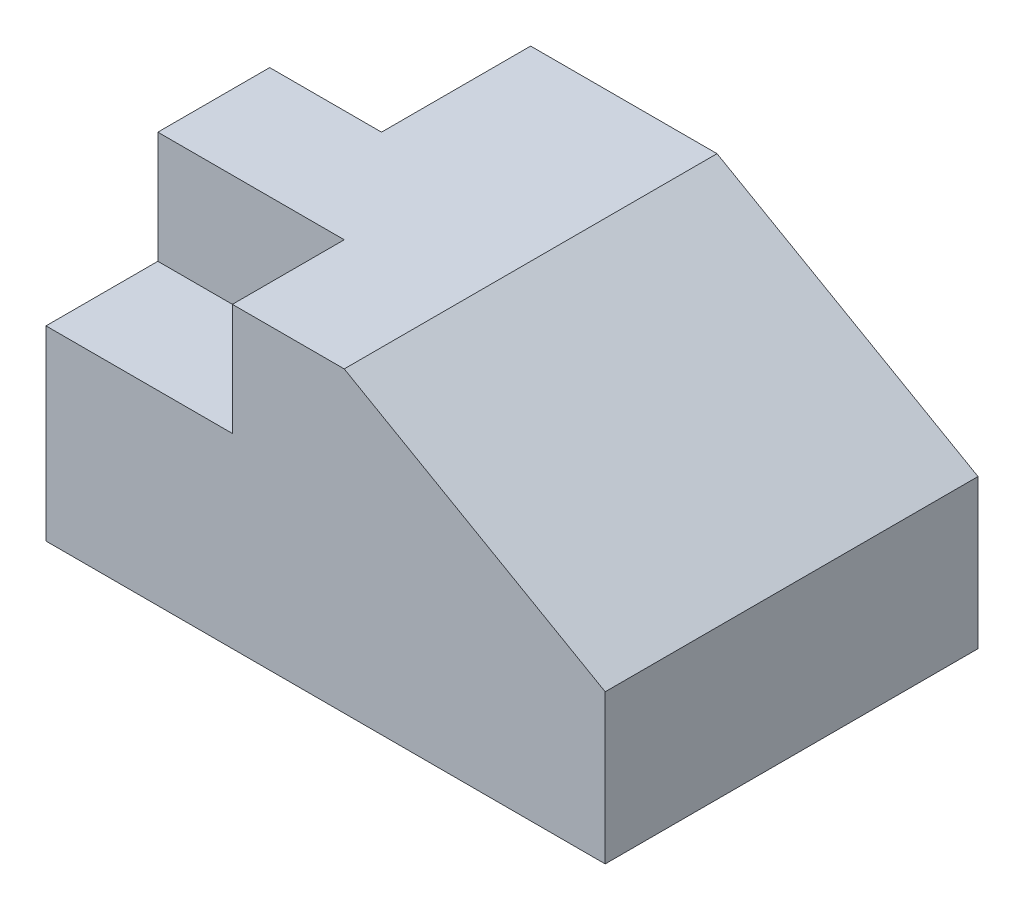
ISO-10303-21;
HEADER;
FILE_DESCRIPTION(('STEP AP214'),'2;1');
FILE_NAME('part.step','',(''),(''),'','','');
FILE_SCHEMA(('AUTOMOTIVE_DESIGN { 1 0 10303 214 1 1 1 1 }'));
ENDSEC;
DATA;
#1=APPLICATION_CONTEXT('core data for automotive mechanical design processes');
#2=APPLICATION_PROTOCOL_DEFINITION('international standard','automotive_design',2000,#1);
#3=PRODUCT_CONTEXT('',#1,'mechanical');
#4=PRODUCT('Part','Part','',(#3));
#5=PRODUCT_RELATED_PRODUCT_CATEGORY('part','',(#4));
#6=PRODUCT_DEFINITION_FORMATION('','',#4);
#7=PRODUCT_DEFINITION_CONTEXT('part definition',#1,'design');
#8=PRODUCT_DEFINITION('design','',#6,#7);
#9=PRODUCT_DEFINITION_SHAPE('','',#8);
#10=(LENGTH_UNIT() NAMED_UNIT(*) SI_UNIT(.MILLI.,.METRE.));
#11=(NAMED_UNIT(*) PLANE_ANGLE_UNIT() SI_UNIT($,.RADIAN.));
#12=(NAMED_UNIT(*) SI_UNIT($,.STERADIAN.) SOLID_ANGLE_UNIT());
#13=UNCERTAINTY_MEASURE_WITH_UNIT(LENGTH_MEASURE(1.E-05),#10,'distance_accuracy_value','');
#14=(GEOMETRIC_REPRESENTATION_CONTEXT(3) GLOBAL_UNCERTAINTY_ASSIGNED_CONTEXT((#13)) GLOBAL_UNIT_ASSIGNED_CONTEXT((#10,
#11,#12)) REPRESENTATION_CONTEXT('',''));
#15=CARTESIAN_POINT('',(0.,0.,0.));
#16=DIRECTION('',(0.,0.,1.));
#17=DIRECTION('',(1.,0.,0.));
#18=AXIS2_PLACEMENT_3D('',#15,#16,#17);
#19=CARTESIAN_POINT('',(0.,80.,-100.));
#20=DIRECTION('',(-1.,0.,0.));
#21=DIRECTION('',(0.,-1.,0.));
#22=AXIS2_PLACEMENT_3D('',#19,#20,#21);
#23=PLANE('',#22);
#24=DIRECTION('',(0.,1.,0.));
#25=VECTOR('',#24,1.);
#26=CARTESIAN_POINT('',(0.,0.,-60.));
#27=LINE('',#26,#25);
#28=CARTESIAN_POINT('',(0.,0.,-60.));
#29=VERTEX_POINT('',#28);
#30=CARTESIAN_POINT('',(0.,80.,-60.));
#31=VERTEX_POINT('',#30);
#32=EDGE_CURVE('E127',#29,#31,#27,.T.);
#33=ORIENTED_EDGE('',*,*,#32,.F.);
#34=DIRECTION('',(0.,0.,1.));
#35=VECTOR('',#34,1.);
#36=CARTESIAN_POINT('',(0.,0.,-100.));
#37=LINE('',#36,#35);
#38=CARTESIAN_POINT('',(0.,0.,0.));
#39=VERTEX_POINT('',#38);
#40=EDGE_CURVE('E48',#29,#39,#37,.T.);
#41=ORIENTED_EDGE('',*,*,#40,.T.);
#42=DIRECTION('',(0.,-1.,0.));
#43=VECTOR('',#42,1.);
#44=CARTESIAN_POINT('',(0.,80.,0.));
#45=LINE('',#44,#43);
#46=CARTESIAN_POINT('',(0.,50.,0.));
#47=VERTEX_POINT('',#46);
#48=EDGE_CURVE('E165',#47,#39,#45,.T.);
#49=ORIENTED_EDGE('',*,*,#48,.F.);
#50=DIRECTION('',(0.,0.,1.));
#51=VECTOR('',#50,1.);
#52=CARTESIAN_POINT('',(0.,50.,-30.));
#53=LINE('',#52,#51);
#54=CARTESIAN_POINT('',(0.,50.,-30.));
#55=VERTEX_POINT('',#54);
#56=EDGE_CURVE('E70',#55,#47,#53,.T.);
#57=ORIENTED_EDGE('',*,*,#56,.F.);
#58=DIRECTION('',(0.,-1.,0.));
#59=VECTOR('',#58,1.);
#60=CARTESIAN_POINT('',(0.,80.,-30.));
#61=LINE('',#60,#59);
#62=CARTESIAN_POINT('',(0.,80.,-30.));
#63=VERTEX_POINT('',#62);
#64=EDGE_CURVE('E203',#63,#55,#61,.T.);
#65=ORIENTED_EDGE('',*,*,#64,.F.);
#66=DIRECTION('',(0.,0.,1.));
#67=VECTOR('',#66,1.);
#68=CARTESIAN_POINT('',(0.,80.,-100.));
#69=LINE('',#68,#67);
#70=EDGE_CURVE('E11',#31,#63,#69,.T.);
#71=ORIENTED_EDGE('',*,*,#70,.F.);
#72=EDGE_LOOP('',(#33,#41,#49,#57,#65,#71));
#73=FACE_BOUND('',#72,.T.);
#74=ADVANCED_FACE('F45',(#73),#23,.T.);
#75=CARTESIAN_POINT('',(80.,80.,-100.));
#76=DIRECTION('',(0.,1.,0.));
#77=DIRECTION('',(-1.,0.,0.));
#78=AXIS2_PLACEMENT_3D('',#75,#76,#77);
#79=PLANE('',#78);
#80=DIRECTION('',(0.,0.,-1.));
#81=VECTOR('',#80,1.);
#82=CARTESIAN_POINT('',(30.,80.,-100.));
#83=LINE('',#82,#81);
#84=CARTESIAN_POINT('',(30.,80.,-60.));
#85=VERTEX_POINT('',#84);
#86=CARTESIAN_POINT('',(30.,80.,-100.));
#87=VERTEX_POINT('',#86);
#88=EDGE_CURVE('E62',#85,#87,#83,.T.);
#89=ORIENTED_EDGE('',*,*,#88,.F.);
#90=DIRECTION('',(1.,0.,0.));
#91=VECTOR('',#90,1.);
#92=CARTESIAN_POINT('',(0.,80.,-60.));
#93=LINE('',#92,#91);
#94=EDGE_CURVE('E243',#31,#85,#93,.T.);
#95=ORIENTED_EDGE('',*,*,#94,.F.);
#96=ORIENTED_EDGE('',*,*,#70,.T.);
#97=DIRECTION('',(-1.,0.,0.));
#98=VECTOR('',#97,1.);
#99=CARTESIAN_POINT('',(0.,80.,-30.));
#100=LINE('',#99,#98);
#101=CARTESIAN_POINT('',(50.,80.,-30.));
#102=VERTEX_POINT('',#101);
#103=EDGE_CURVE('E206',#102,#63,#100,.T.);
#104=ORIENTED_EDGE('',*,*,#103,.F.);
#105=DIRECTION('',(0.,0.,1.));
#106=VECTOR('',#105,1.);
#107=CARTESIAN_POINT('',(50.,80.,-30.));
#108=LINE('',#107,#106);
#109=CARTESIAN_POINT('',(50.,80.,0.));
#110=VERTEX_POINT('',#109);
#111=EDGE_CURVE('E168',#102,#110,#108,.T.);
#112=ORIENTED_EDGE('',*,*,#111,.T.);
#113=DIRECTION('',(-1.,0.,0.));
#114=VECTOR('',#113,1.);
#115=CARTESIAN_POINT('',(80.,80.,0.));
#116=LINE('',#115,#114);
#117=CARTESIAN_POINT('',(80.,80.,0.));
#118=VERTEX_POINT('',#117);
#119=EDGE_CURVE('E179',#118,#110,#116,.T.);
#120=ORIENTED_EDGE('',*,*,#119,.F.);
#121=DIRECTION('',(0.,0.,1.));
#122=VECTOR('',#121,1.);
#123=CARTESIAN_POINT('',(80.,80.,-100.));
#124=LINE('',#123,#122);
#125=CARTESIAN_POINT('',(80.,80.,-100.));
#126=VERTEX_POINT('',#125);
#127=EDGE_CURVE('E54',#126,#118,#124,.T.);
#128=ORIENTED_EDGE('',*,*,#127,.F.);
#129=DIRECTION('',(-1.,0.,0.));
#130=VECTOR('',#129,1.);
#131=CARTESIAN_POINT('',(80.,80.,-100.));
#132=LINE('',#131,#130);
#133=EDGE_CURVE('E150',#126,#87,#132,.T.);
#134=ORIENTED_EDGE('',*,*,#133,.T.);
#135=EDGE_LOOP('',(#89,#95,#96,#104,#112,#120,#128,#134));
#136=FACE_BOUND('',#135,.T.);
#137=ADVANCED_FACE('F264',(#136),#79,.T.);
#138=CARTESIAN_POINT('',(150.,40.,-100.));
#139=DIRECTION('',(0.496138938356834,0.868243142124459,0.));
#140=DIRECTION('',(-0.868243142124459,0.496138938356834,0.));
#141=AXIS2_PLACEMENT_3D('',#138,#139,#140);
#142=PLANE('',#141);
#143=DIRECTION('',(-0.868243142124459,0.496138938356834,0.));
#144=VECTOR('',#143,1.);
#145=CARTESIAN_POINT('',(150.,40.,0.));
#146=LINE('',#145,#144);
#147=CARTESIAN_POINT('',(150.,40.,0.));
#148=VERTEX_POINT('',#147);
#149=EDGE_CURVE('E175',#148,#118,#146,.T.);
#150=ORIENTED_EDGE('',*,*,#149,.F.);
#151=DIRECTION('',(0.,0.,1.));
#152=VECTOR('',#151,1.);
#153=CARTESIAN_POINT('',(150.,40.,-100.));
#154=LINE('',#153,#152);
#155=CARTESIAN_POINT('',(150.,40.,-100.));
#156=VERTEX_POINT('',#155);
#157=EDGE_CURVE('E153',#156,#148,#154,.T.);
#158=ORIENTED_EDGE('',*,*,#157,.F.);
#159=DIRECTION('',(-0.868243142124459,0.496138938356834,0.));
#160=VECTOR('',#159,1.);
#161=CARTESIAN_POINT('',(150.,40.,-100.));
#162=LINE('',#161,#160);
#163=EDGE_CURVE('E155',#156,#126,#162,.T.);
#164=ORIENTED_EDGE('',*,*,#163,.T.);
#165=ORIENTED_EDGE('',*,*,#127,.T.);
#166=EDGE_LOOP('',(#150,#158,#164,#165));
#167=FACE_BOUND('',#166,.T.);
#168=ADVANCED_FACE('F196',(#167),#142,.T.);
#169=CARTESIAN_POINT('',(150.,0.,-100.));
#170=DIRECTION('',(1.,0.,0.));
#171=DIRECTION('',(0.,0.,-1.));
#172=AXIS2_PLACEMENT_3D('',#169,#170,#171);
#173=PLANE('',#172);
#174=DIRECTION('',(0.,1.,0.));
#175=VECTOR('',#174,1.);
#176=CARTESIAN_POINT('',(150.,0.,0.));
#177=LINE('',#176,#175);
#178=CARTESIAN_POINT('',(150.,0.,0.));
#179=VERTEX_POINT('',#178);
#180=EDGE_CURVE('E171',#179,#148,#177,.T.);
#181=ORIENTED_EDGE('',*,*,#180,.F.);
#182=DIRECTION('',(0.,0.,1.));
#183=VECTOR('',#182,1.);
#184=CARTESIAN_POINT('',(150.,0.,-100.));
#185=LINE('',#184,#183);
#186=CARTESIAN_POINT('',(150.,0.,-100.));
#187=VERTEX_POINT('',#186);
#188=EDGE_CURVE('E149',#187,#179,#185,.T.);
#189=ORIENTED_EDGE('',*,*,#188,.F.);
#190=DIRECTION('',(0.,1.,0.));
#191=VECTOR('',#190,1.);
#192=CARTESIAN_POINT('',(150.,0.,-100.));
#193=LINE('',#192,#191);
#194=EDGE_CURVE('E161',#187,#156,#193,.T.);
#195=ORIENTED_EDGE('',*,*,#194,.T.);
#196=ORIENTED_EDGE('',*,*,#157,.T.);
#197=EDGE_LOOP('',(#181,#189,#195,#196));
#198=FACE_BOUND('',#197,.T.);
#199=ADVANCED_FACE('F191',(#198),#173,.T.);
#200=CARTESIAN_POINT('',(0.,0.,-100.));
#201=DIRECTION('',(0.,-1.,0.));
#202=DIRECTION('',(0.,0.,-1.));
#203=AXIS2_PLACEMENT_3D('',#200,#201,#202);
#204=PLANE('',#203);
#205=DIRECTION('',(0.,0.,-1.));
#206=VECTOR('',#205,1.);
#207=CARTESIAN_POINT('',(30.,0.,-100.));
#208=LINE('',#207,#206);
#209=CARTESIAN_POINT('',(30.,0.,-60.));
#210=VERTEX_POINT('',#209);
#211=CARTESIAN_POINT('',(30.,0.,-100.));
#212=VERTEX_POINT('',#211);
#213=EDGE_CURVE('E135',#210,#212,#208,.T.);
#214=ORIENTED_EDGE('',*,*,#213,.T.);
#215=DIRECTION('',(1.,0.,0.));
#216=VECTOR('',#215,1.);
#217=CARTESIAN_POINT('',(0.,0.,-100.));
#218=LINE('',#217,#216);
#219=EDGE_CURVE('E182',#212,#187,#218,.T.);
#220=ORIENTED_EDGE('',*,*,#219,.T.);
#221=ORIENTED_EDGE('',*,*,#188,.T.);
#222=DIRECTION('',(1.,0.,0.));
#223=VECTOR('',#222,1.);
#224=CARTESIAN_POINT('',(0.,0.,0.));
#225=LINE('',#224,#223);
#226=EDGE_CURVE('E147',#39,#179,#225,.T.);
#227=ORIENTED_EDGE('',*,*,#226,.F.);
#228=ORIENTED_EDGE('',*,*,#40,.F.);
#229=DIRECTION('',(1.,0.,0.));
#230=VECTOR('',#229,1.);
#231=CARTESIAN_POINT('',(0.,0.,-60.));
#232=LINE('',#231,#230);
#233=EDGE_CURVE('E123',#29,#210,#232,.T.);
#234=ORIENTED_EDGE('',*,*,#233,.T.);
#235=EDGE_LOOP('',(#214,#220,#221,#227,#228,#234));
#236=FACE_BOUND('',#235,.T.);
#237=ADVANCED_FACE('F145',(#236),#204,.T.);
#238=CARTESIAN_POINT('',(0.,0.,-100.));
#239=DIRECTION('',(0.,0.,1.));
#240=DIRECTION('',(1.,0.,0.));
#241=AXIS2_PLACEMENT_3D('',#238,#239,#240);
#242=PLANE('',#241);
#243=ORIENTED_EDGE('',*,*,#219,.F.);
#244=DIRECTION('',(0.,1.,0.));
#245=VECTOR('',#244,1.);
#246=CARTESIAN_POINT('',(30.,0.,-100.));
#247=LINE('',#246,#245);
#248=EDGE_CURVE('E226',#212,#87,#247,.T.);
#249=ORIENTED_EDGE('',*,*,#248,.T.);
#250=ORIENTED_EDGE('',*,*,#133,.F.);
#251=ORIENTED_EDGE('',*,*,#163,.F.);
#252=ORIENTED_EDGE('',*,*,#194,.F.);
#253=EDGE_LOOP('',(#243,#249,#250,#251,#252));
#254=FACE_BOUND('',#253,.T.);
#255=ADVANCED_FACE('F249',(#254),#242,.F.);
#256=CARTESIAN_POINT('',(0.,0.,0.));
#257=DIRECTION('',(0.,0.,1.));
#258=DIRECTION('',(1.,0.,0.));
#259=AXIS2_PLACEMENT_3D('',#256,#257,#258);
#260=PLANE('',#259);
#261=DIRECTION('',(0.,1.,0.));
#262=VECTOR('',#261,1.);
#263=CARTESIAN_POINT('',(50.,80.,0.));
#264=LINE('',#263,#262);
#265=CARTESIAN_POINT('',(50.,50.,0.));
#266=VERTEX_POINT('',#265);
#267=EDGE_CURVE('E222',#266,#110,#264,.T.);
#268=ORIENTED_EDGE('',*,*,#267,.F.);
#269=DIRECTION('',(1.,0.,0.));
#270=VECTOR('',#269,1.);
#271=CARTESIAN_POINT('',(0.,50.,0.));
#272=LINE('',#271,#270);
#273=EDGE_CURVE('E201',#47,#266,#272,.T.);
#274=ORIENTED_EDGE('',*,*,#273,.F.);
#275=ORIENTED_EDGE('',*,*,#48,.T.);
#276=ORIENTED_EDGE('',*,*,#226,.T.);
#277=ORIENTED_EDGE('',*,*,#180,.T.);
#278=ORIENTED_EDGE('',*,*,#149,.T.);
#279=ORIENTED_EDGE('',*,*,#119,.T.);
#280=EDGE_LOOP('',(#268,#274,#275,#276,#277,#278,#279));
#281=FACE_BOUND('',#280,.T.);
#282=ADVANCED_FACE('F200',(#281),#260,.T.);
#283=CARTESIAN_POINT('',(50.,80.,-30.));
#284=DIRECTION('',(1.,0.,0.));
#285=DIRECTION('',(0.,0.,-1.));
#286=AXIS2_PLACEMENT_3D('',#283,#284,#285);
#287=PLANE('',#286);
#288=ORIENTED_EDGE('',*,*,#267,.T.);
#289=ORIENTED_EDGE('',*,*,#111,.F.);
#290=DIRECTION('',(0.,1.,0.));
#291=VECTOR('',#290,1.);
#292=CARTESIAN_POINT('',(50.,80.,-30.));
#293=LINE('',#292,#291);
#294=CARTESIAN_POINT('',(50.,50.,-30.));
#295=VERTEX_POINT('',#294);
#296=EDGE_CURVE('E212',#295,#102,#293,.T.);
#297=ORIENTED_EDGE('',*,*,#296,.F.);
#298=DIRECTION('',(0.,0.,1.));
#299=VECTOR('',#298,1.);
#300=CARTESIAN_POINT('',(50.,50.,-30.));
#301=LINE('',#300,#299);
#302=EDGE_CURVE('E205',#295,#266,#301,.T.);
#303=ORIENTED_EDGE('',*,*,#302,.T.);
#304=EDGE_LOOP('',(#288,#289,#297,#303));
#305=FACE_BOUND('',#304,.T.);
#306=ADVANCED_FACE('F283',(#305),#287,.F.);
#307=CARTESIAN_POINT('',(0.,50.,-30.));
#308=DIRECTION('',(0.,-1.,0.));
#309=DIRECTION('',(0.,0.,-1.));
#310=AXIS2_PLACEMENT_3D('',#307,#308,#309);
#311=PLANE('',#310);
#312=ORIENTED_EDGE('',*,*,#273,.T.);
#313=ORIENTED_EDGE('',*,*,#302,.F.);
#314=DIRECTION('',(1.,0.,0.));
#315=VECTOR('',#314,1.);
#316=CARTESIAN_POINT('',(0.,50.,-30.));
#317=LINE('',#316,#315);
#318=EDGE_CURVE('E231',#55,#295,#317,.T.);
#319=ORIENTED_EDGE('',*,*,#318,.F.);
#320=ORIENTED_EDGE('',*,*,#56,.T.);
#321=EDGE_LOOP('',(#312,#313,#319,#320));
#322=FACE_BOUND('',#321,.T.);
#323=ADVANCED_FACE('F260',(#322),#311,.F.);
#324=CARTESIAN_POINT('',(0.,0.,-30.));
#325=DIRECTION('',(0.,0.,1.));
#326=DIRECTION('',(1.,0.,0.));
#327=AXIS2_PLACEMENT_3D('',#324,#325,#326);
#328=PLANE('',#327);
#329=ORIENTED_EDGE('',*,*,#64,.T.);
#330=ORIENTED_EDGE('',*,*,#318,.T.);
#331=ORIENTED_EDGE('',*,*,#296,.T.);
#332=ORIENTED_EDGE('',*,*,#103,.T.);
#333=EDGE_LOOP('',(#329,#330,#331,#332));
#334=FACE_BOUND('',#333,.T.);
#335=ADVANCED_FACE('F252',(#334),#328,.T.);
#336=CARTESIAN_POINT('',(30.,0.,-100.));
#337=DIRECTION('',(1.,0.,0.));
#338=DIRECTION('',(0.,1.,0.));
#339=AXIS2_PLACEMENT_3D('',#336,#337,#338);
#340=PLANE('',#339);
#341=ORIENTED_EDGE('',*,*,#88,.T.);
#342=ORIENTED_EDGE('',*,*,#248,.F.);
#343=ORIENTED_EDGE('',*,*,#213,.F.);
#344=DIRECTION('',(0.,1.,0.));
#345=VECTOR('',#344,1.);
#346=CARTESIAN_POINT('',(30.,0.,-60.));
#347=LINE('',#346,#345);
#348=EDGE_CURVE('E129',#210,#85,#347,.T.);
#349=ORIENTED_EDGE('',*,*,#348,.T.);
#350=EDGE_LOOP('',(#341,#342,#343,#349));
#351=FACE_BOUND('',#350,.T.);
#352=ADVANCED_FACE('F250',(#351),#340,.F.);
#353=CARTESIAN_POINT('',(0.,0.,-60.));
#354=DIRECTION('',(0.,0.,1.));
#355=DIRECTION('',(1.,0.,0.));
#356=AXIS2_PLACEMENT_3D('',#353,#354,#355);
#357=PLANE('',#356);
#358=ORIENTED_EDGE('',*,*,#94,.T.);
#359=ORIENTED_EDGE('',*,*,#348,.F.);
#360=ORIENTED_EDGE('',*,*,#233,.F.);
#361=ORIENTED_EDGE('',*,*,#32,.T.);
#362=EDGE_LOOP('',(#358,#359,#360,#361));
#363=FACE_BOUND('',#362,.T.);
#364=ADVANCED_FACE('F126',(#363),#357,.F.);
#365=CLOSED_SHELL('',(#74,#137,#168,#199,#237,#255,#282,#306,#323,#335,#352,#364));
#366=MANIFOLD_SOLID_BREP('B2',#365);
#367=ADVANCED_BREP_SHAPE_REPRESENTATION('',(#18,#366),#14);
#368=SHAPE_DEFINITION_REPRESENTATION(#9,#367);
ENDSEC;
END-ISO-10303-21;
